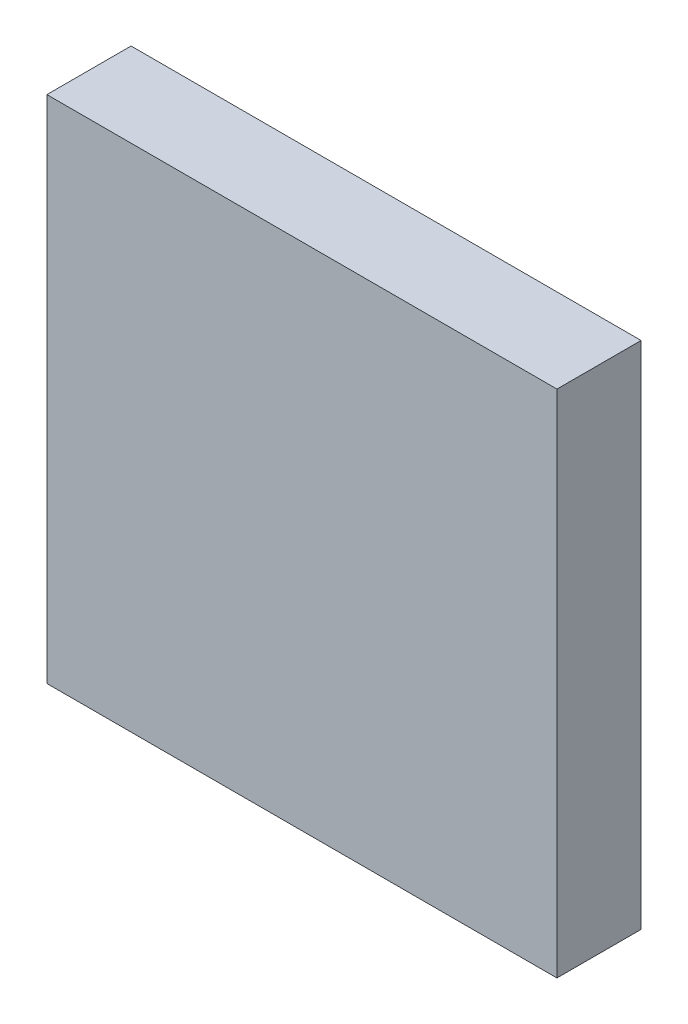
ISO-10303-21;
HEADER;
FILE_DESCRIPTION(('STEP AP214'),'2;1');
FILE_NAME('part.step','',(''),(''),'','','');
FILE_SCHEMA(('AUTOMOTIVE_DESIGN { 1 0 10303 214 1 1 1 1 }'));
ENDSEC;
DATA;
#1=APPLICATION_CONTEXT('core data for automotive mechanical design processes');
#2=APPLICATION_PROTOCOL_DEFINITION('international standard','automotive_design',2000,#1);
#3=PRODUCT_CONTEXT('',#1,'mechanical');
#4=PRODUCT('Part','Part','',(#3));
#5=PRODUCT_RELATED_PRODUCT_CATEGORY('part','',(#4));
#6=PRODUCT_DEFINITION_FORMATION('','',#4);
#7=PRODUCT_DEFINITION_CONTEXT('part definition',#1,'design');
#8=PRODUCT_DEFINITION('design','',#6,#7);
#9=PRODUCT_DEFINITION_SHAPE('','',#8);
#10=(LENGTH_UNIT() NAMED_UNIT(*) SI_UNIT(.MILLI.,.METRE.));
#11=(NAMED_UNIT(*) PLANE_ANGLE_UNIT() SI_UNIT($,.RADIAN.));
#12=(NAMED_UNIT(*) SI_UNIT($,.STERADIAN.) SOLID_ANGLE_UNIT());
#13=UNCERTAINTY_MEASURE_WITH_UNIT(LENGTH_MEASURE(1.E-05),#10,'distance_accuracy_value','');
#14=(GEOMETRIC_REPRESENTATION_CONTEXT(3) GLOBAL_UNCERTAINTY_ASSIGNED_CONTEXT((#13)) GLOBAL_UNIT_ASSIGNED_CONTEXT((#10,
#11,#12)) REPRESENTATION_CONTEXT('',''));
#15=CARTESIAN_POINT('',(0.,0.,0.));
#16=DIRECTION('',(0.,0.,1.));
#17=DIRECTION('',(1.,0.,0.));
#18=AXIS2_PLACEMENT_3D('',#15,#16,#17);
#19=CARTESIAN_POINT('',(10.,10.,3.3));
#20=DIRECTION('',(-1.,0.,0.));
#21=DIRECTION('',(0.,-1.,0.));
#22=AXIS2_PLACEMENT_3D('',#19,#20,#21);
#23=PLANE('',#22);
#24=DIRECTION('',(0.,1.,0.));
#25=VECTOR('',#24,1.);
#26=CARTESIAN_POINT('',(10.,10.,0.));
#27=LINE('',#26,#25);
#28=CARTESIAN_POINT('',(10.,-10.,0.));
#29=VERTEX_POINT('',#28);
#30=CARTESIAN_POINT('',(10.,10.,0.));
#31=VERTEX_POINT('',#30);
#32=EDGE_CURVE('E96',#29,#31,#27,.T.);
#33=ORIENTED_EDGE('',*,*,#32,.T.);
#34=DIRECTION('',(0.,0.,-1.));
#35=VECTOR('',#34,1.);
#36=CARTESIAN_POINT('',(10.,10.,3.3));
#37=LINE('',#36,#35);
#38=CARTESIAN_POINT('',(10.,10.,3.3));
#39=VERTEX_POINT('',#38);
#40=EDGE_CURVE('E11',#39,#31,#37,.T.);
#41=ORIENTED_EDGE('',*,*,#40,.F.);
#42=DIRECTION('',(0.,1.,0.));
#43=VECTOR('',#42,1.);
#44=CARTESIAN_POINT('',(10.,10.,3.3));
#45=LINE('',#44,#43);
#46=CARTESIAN_POINT('',(10.,-10.,3.3));
#47=VERTEX_POINT('',#46);
#48=EDGE_CURVE('E84',#47,#39,#45,.T.);
#49=ORIENTED_EDGE('',*,*,#48,.F.);
#50=DIRECTION('',(0.,0.,-1.));
#51=VECTOR('',#50,1.);
#52=CARTESIAN_POINT('',(10.,-10.,3.3));
#53=LINE('',#52,#51);
#54=EDGE_CURVE('E92',#47,#29,#53,.T.);
#55=ORIENTED_EDGE('',*,*,#54,.T.);
#56=EDGE_LOOP('',(#33,#41,#49,#55));
#57=FACE_BOUND('',#56,.T.);
#58=ADVANCED_FACE('F33',(#57),#23,.F.);
#59=CARTESIAN_POINT('',(-10.,10.,3.3));
#60=DIRECTION('',(0.,-1.,0.));
#61=DIRECTION('',(0.,0.,-1.));
#62=AXIS2_PLACEMENT_3D('',#59,#60,#61);
#63=PLANE('',#62);
#64=DIRECTION('',(-1.,0.,0.));
#65=VECTOR('',#64,1.);
#66=CARTESIAN_POINT('',(-10.,10.,0.));
#67=LINE('',#66,#65);
#68=CARTESIAN_POINT('',(-10.,10.,0.));
#69=VERTEX_POINT('',#68);
#70=EDGE_CURVE('E88',#31,#69,#67,.T.);
#71=ORIENTED_EDGE('',*,*,#70,.T.);
#72=DIRECTION('',(0.,0.,-1.));
#73=VECTOR('',#72,1.);
#74=CARTESIAN_POINT('',(-10.,10.,3.3));
#75=LINE('',#74,#73);
#76=CARTESIAN_POINT('',(-10.,10.,3.3));
#77=VERTEX_POINT('',#76);
#78=EDGE_CURVE('E41',#77,#69,#75,.T.);
#79=ORIENTED_EDGE('',*,*,#78,.F.);
#80=DIRECTION('',(-1.,0.,0.));
#81=VECTOR('',#80,1.);
#82=CARTESIAN_POINT('',(-10.,10.,3.3));
#83=LINE('',#82,#81);
#84=EDGE_CURVE('E79',#39,#77,#83,.T.);
#85=ORIENTED_EDGE('',*,*,#84,.F.);
#86=ORIENTED_EDGE('',*,*,#40,.T.);
#87=EDGE_LOOP('',(#71,#79,#85,#86));
#88=FACE_BOUND('',#87,.T.);
#89=ADVANCED_FACE('F87',(#88),#63,.F.);
#90=CARTESIAN_POINT('',(-10.,10.,3.3));
#91=DIRECTION('',(1.,0.,0.));
#92=DIRECTION('',(0.,0.,-1.));
#93=AXIS2_PLACEMENT_3D('',#90,#91,#92);
#94=PLANE('',#93);
#95=DIRECTION('',(0.,-1.,0.));
#96=VECTOR('',#95,1.);
#97=CARTESIAN_POINT('',(-10.,10.,0.));
#98=LINE('',#97,#96);
#99=CARTESIAN_POINT('',(-10.,-10.,0.));
#100=VERTEX_POINT('',#99);
#101=EDGE_CURVE('E66',#69,#100,#98,.T.);
#102=ORIENTED_EDGE('',*,*,#101,.T.);
#103=DIRECTION('',(0.,0.,-1.));
#104=VECTOR('',#103,1.);
#105=CARTESIAN_POINT('',(-10.,-10.,3.3));
#106=LINE('',#105,#104);
#107=CARTESIAN_POINT('',(-10.,-10.,3.3));
#108=VERTEX_POINT('',#107);
#109=EDGE_CURVE('E89',#108,#100,#106,.T.);
#110=ORIENTED_EDGE('',*,*,#109,.F.);
#111=DIRECTION('',(0.,-1.,0.));
#112=VECTOR('',#111,1.);
#113=CARTESIAN_POINT('',(-10.,10.,3.3));
#114=LINE('',#113,#112);
#115=EDGE_CURVE('E82',#77,#108,#114,.T.);
#116=ORIENTED_EDGE('',*,*,#115,.F.);
#117=ORIENTED_EDGE('',*,*,#78,.T.);
#118=EDGE_LOOP('',(#102,#110,#116,#117));
#119=FACE_BOUND('',#118,.T.);
#120=ADVANCED_FACE('F90',(#119),#94,.F.);
#121=CARTESIAN_POINT('',(-10.,-10.,3.3));
#122=DIRECTION('',(0.,1.,0.));
#123=DIRECTION('',(0.,0.,1.));
#124=AXIS2_PLACEMENT_3D('',#121,#122,#123);
#125=PLANE('',#124);
#126=DIRECTION('',(1.,0.,0.));
#127=VECTOR('',#126,1.);
#128=CARTESIAN_POINT('',(-10.,-10.,0.));
#129=LINE('',#128,#127);
#130=EDGE_CURVE('E72',#100,#29,#129,.T.);
#131=ORIENTED_EDGE('',*,*,#130,.T.);
#132=ORIENTED_EDGE('',*,*,#54,.F.);
#133=DIRECTION('',(1.,0.,0.));
#134=VECTOR('',#133,1.);
#135=CARTESIAN_POINT('',(-10.,-10.,3.3));
#136=LINE('',#135,#134);
#137=EDGE_CURVE('E49',#108,#47,#136,.T.);
#138=ORIENTED_EDGE('',*,*,#137,.F.);
#139=ORIENTED_EDGE('',*,*,#109,.T.);
#140=EDGE_LOOP('',(#131,#132,#138,#139));
#141=FACE_BOUND('',#140,.T.);
#142=ADVANCED_FACE('F103',(#141),#125,.F.);
#143=CARTESIAN_POINT('',(0.,0.,3.3));
#144=DIRECTION('',(0.,0.,1.));
#145=DIRECTION('',(1.,0.,0.));
#146=AXIS2_PLACEMENT_3D('',#143,#144,#145);
#147=PLANE('',#146);
#148=ORIENTED_EDGE('',*,*,#48,.T.);
#149=ORIENTED_EDGE('',*,*,#84,.T.);
#150=ORIENTED_EDGE('',*,*,#115,.T.);
#151=ORIENTED_EDGE('',*,*,#137,.T.);
#152=EDGE_LOOP('',(#148,#149,#150,#151));
#153=FACE_BOUND('',#152,.T.);
#154=ADVANCED_FACE('F80',(#153),#147,.T.);
#155=CARTESIAN_POINT('',(0.,0.,0.));
#156=DIRECTION('',(0.,0.,1.));
#157=DIRECTION('',(1.,0.,0.));
#158=AXIS2_PLACEMENT_3D('',#155,#156,#157);
#159=PLANE('',#158);
#160=ORIENTED_EDGE('',*,*,#32,.F.);
#161=ORIENTED_EDGE('',*,*,#130,.F.);
#162=ORIENTED_EDGE('',*,*,#101,.F.);
#163=ORIENTED_EDGE('',*,*,#70,.F.);
#164=EDGE_LOOP('',(#160,#161,#162,#163));
#165=FACE_BOUND('',#164,.T.);
#166=ADVANCED_FACE('F106',(#165),#159,.F.);
#167=CLOSED_SHELL('',(#58,#89,#120,#142,#154,#166));
#168=MANIFOLD_SOLID_BREP('B2',#167);
#169=ADVANCED_BREP_SHAPE_REPRESENTATION('',(#18,#168),#14);
#170=SHAPE_DEFINITION_REPRESENTATION(#9,#169);
ENDSEC;
END-ISO-10303-21;
